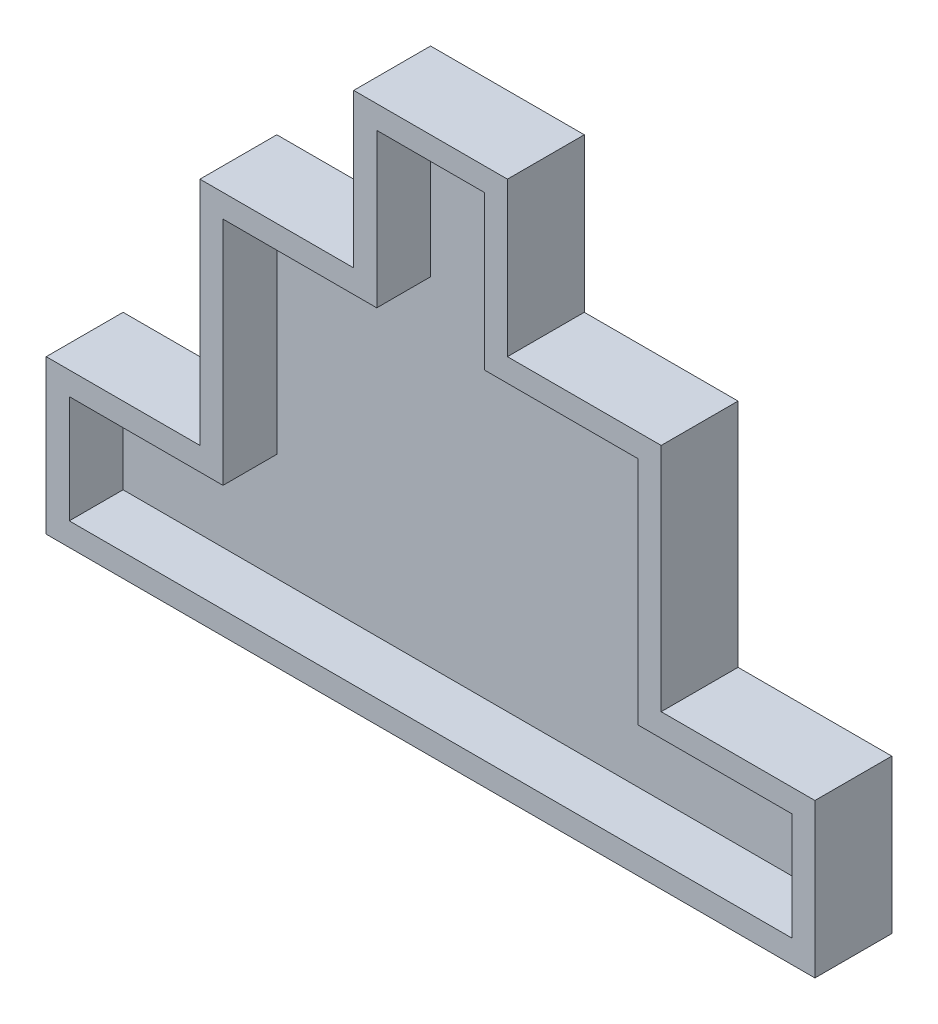
ISO-10303-21;
HEADER;
FILE_DESCRIPTION(('STEP AP214'),'2;1');
FILE_NAME('part.step','',(''),(''),'','','');
FILE_SCHEMA(('AUTOMOTIVE_DESIGN { 1 0 10303 214 1 1 1 1 }'));
ENDSEC;
DATA;
#1=APPLICATION_CONTEXT('core data for automotive mechanical design processes');
#2=APPLICATION_PROTOCOL_DEFINITION('international standard','automotive_design',2000,#1);
#3=PRODUCT_CONTEXT('',#1,'mechanical');
#4=PRODUCT('Part','Part','',(#3));
#5=PRODUCT_RELATED_PRODUCT_CATEGORY('part','',(#4));
#6=PRODUCT_DEFINITION_FORMATION('','',#4);
#7=PRODUCT_DEFINITION_CONTEXT('part definition',#1,'design');
#8=PRODUCT_DEFINITION('design','',#6,#7);
#9=PRODUCT_DEFINITION_SHAPE('','',#8);
#10=(LENGTH_UNIT() NAMED_UNIT(*) SI_UNIT(.MILLI.,.METRE.));
#11=(NAMED_UNIT(*) PLANE_ANGLE_UNIT() SI_UNIT($,.RADIAN.));
#12=(NAMED_UNIT(*) SI_UNIT($,.STERADIAN.) SOLID_ANGLE_UNIT());
#13=UNCERTAINTY_MEASURE_WITH_UNIT(LENGTH_MEASURE(1.E-05),#10,'distance_accuracy_value','');
#14=(GEOMETRIC_REPRESENTATION_CONTEXT(3) GLOBAL_UNCERTAINTY_ASSIGNED_CONTEXT((#13)) GLOBAL_UNIT_ASSIGNED_CONTEXT((#10,
#11,#12)) REPRESENTATION_CONTEXT('',''));
#15=CARTESIAN_POINT('',(0.,0.,0.));
#16=DIRECTION('',(0.,0.,1.));
#17=DIRECTION('',(1.,0.,0.));
#18=AXIS2_PLACEMENT_3D('',#15,#16,#17);
#19=CARTESIAN_POINT('',(-75.,0.,4.5));
#20=DIRECTION('',(1.,0.,0.));
#21=DIRECTION('',(0.,0.,-1.));
#22=AXIS2_PLACEMENT_3D('',#19,#20,#21);
#23=PLANE('',#22);
#24=DIRECTION('',(0.,-1.,0.));
#25=VECTOR('',#24,1.);
#26=CARTESIAN_POINT('',(-75.,0.,0.));
#27=LINE('',#26,#25);
#28=CARTESIAN_POINT('',(-75.,30.,0.));
#29=VERTEX_POINT('',#28);
#30=CARTESIAN_POINT('',(-75.,0.,0.));
#31=VERTEX_POINT('',#30);
#32=EDGE_CURVE('E379',#29,#31,#27,.T.);
#33=ORIENTED_EDGE('',*,*,#32,.T.);
#34=DIRECTION('',(0.,0.,-1.));
#35=VECTOR('',#34,1.);
#36=CARTESIAN_POINT('',(-75.,0.,4.5));
#37=LINE('',#36,#35);
#38=CARTESIAN_POINT('',(-75.,0.,15.));
#39=VERTEX_POINT('',#38);
#40=EDGE_CURVE('E11',#39,#31,#37,.T.);
#41=ORIENTED_EDGE('',*,*,#40,.F.);
#42=DIRECTION('',(0.,-1.,0.));
#43=VECTOR('',#42,1.);
#44=CARTESIAN_POINT('',(-75.,0.,15.));
#45=LINE('',#44,#43);
#46=CARTESIAN_POINT('',(-75.,30.,15.));
#47=VERTEX_POINT('',#46);
#48=EDGE_CURVE('E351',#47,#39,#45,.T.);
#49=ORIENTED_EDGE('',*,*,#48,.F.);
#50=DIRECTION('',(0.,0.,-1.));
#51=VECTOR('',#50,1.);
#52=CARTESIAN_POINT('',(-75.,30.,4.5));
#53=LINE('',#52,#51);
#54=EDGE_CURVE('E415',#47,#29,#53,.T.);
#55=ORIENTED_EDGE('',*,*,#54,.T.);
#56=EDGE_LOOP('',(#33,#41,#49,#55));
#57=FACE_BOUND('',#56,.T.);
#58=ADVANCED_FACE('F39',(#57),#23,.F.);
#59=CARTESIAN_POINT('',(75.,0.,4.5));
#60=DIRECTION('',(0.,1.,0.));
#61=DIRECTION('',(0.,0.,1.));
#62=AXIS2_PLACEMENT_3D('',#59,#60,#61);
#63=PLANE('',#62);
#64=DIRECTION('',(1.,0.,0.));
#65=VECTOR('',#64,1.);
#66=CARTESIAN_POINT('',(75.,0.,0.));
#67=LINE('',#66,#65);
#68=CARTESIAN_POINT('',(75.,0.,0.));
#69=VERTEX_POINT('',#68);
#70=EDGE_CURVE('E383',#31,#69,#67,.T.);
#71=ORIENTED_EDGE('',*,*,#70,.T.);
#72=DIRECTION('',(0.,0.,-1.));
#73=VECTOR('',#72,1.);
#74=CARTESIAN_POINT('',(75.,0.,4.5));
#75=LINE('',#74,#73);
#76=CARTESIAN_POINT('',(75.,0.,15.));
#77=VERTEX_POINT('',#76);
#78=EDGE_CURVE('E47',#77,#69,#75,.T.);
#79=ORIENTED_EDGE('',*,*,#78,.F.);
#80=DIRECTION('',(1.,0.,0.));
#81=VECTOR('',#80,1.);
#82=CARTESIAN_POINT('',(75.,0.,15.));
#83=LINE('',#82,#81);
#84=EDGE_CURVE('E355',#39,#77,#83,.T.);
#85=ORIENTED_EDGE('',*,*,#84,.F.);
#86=ORIENTED_EDGE('',*,*,#40,.T.);
#87=EDGE_LOOP('',(#71,#79,#85,#86));
#88=FACE_BOUND('',#87,.T.);
#89=ADVANCED_FACE('F500',(#88),#63,.F.);
#90=CARTESIAN_POINT('',(75.,0.,4.5));
#91=DIRECTION('',(-1.,0.,0.));
#92=DIRECTION('',(0.,0.,1.));
#93=AXIS2_PLACEMENT_3D('',#90,#91,#92);
#94=PLANE('',#93);
#95=DIRECTION('',(0.,1.,0.));
#96=VECTOR('',#95,1.);
#97=CARTESIAN_POINT('',(75.,0.,0.));
#98=LINE('',#97,#96);
#99=CARTESIAN_POINT('',(75.,30.,0.));
#100=VERTEX_POINT('',#99);
#101=EDGE_CURVE('E386',#69,#100,#98,.T.);
#102=ORIENTED_EDGE('',*,*,#101,.T.);
#103=DIRECTION('',(0.,0.,-1.));
#104=VECTOR('',#103,1.);
#105=CARTESIAN_POINT('',(75.,30.,4.5));
#106=LINE('',#105,#104);
#107=CARTESIAN_POINT('',(75.,30.,15.));
#108=VERTEX_POINT('',#107);
#109=EDGE_CURVE('E449',#108,#100,#106,.T.);
#110=ORIENTED_EDGE('',*,*,#109,.F.);
#111=DIRECTION('',(0.,1.,0.));
#112=VECTOR('',#111,1.);
#113=CARTESIAN_POINT('',(75.,30.,15.));
#114=LINE('',#113,#112);
#115=EDGE_CURVE('E359',#77,#108,#114,.T.);
#116=ORIENTED_EDGE('',*,*,#115,.F.);
#117=ORIENTED_EDGE('',*,*,#78,.T.);
#118=EDGE_LOOP('',(#102,#110,#116,#117));
#119=FACE_BOUND('',#118,.T.);
#120=ADVANCED_FACE('F457',(#119),#94,.F.);
#121=CARTESIAN_POINT('',(75.,30.,4.5));
#122=DIRECTION('',(0.,-1.,0.));
#123=DIRECTION('',(0.,0.,-1.));
#124=AXIS2_PLACEMENT_3D('',#121,#122,#123);
#125=PLANE('',#124);
#126=DIRECTION('',(-1.,0.,0.));
#127=VECTOR('',#126,1.);
#128=CARTESIAN_POINT('',(75.,30.,0.));
#129=LINE('',#128,#127);
#130=CARTESIAN_POINT('',(45.,30.,0.));
#131=VERTEX_POINT('',#130);
#132=EDGE_CURVE('E389',#100,#131,#129,.T.);
#133=ORIENTED_EDGE('',*,*,#132,.T.);
#134=DIRECTION('',(0.,0.,-1.));
#135=VECTOR('',#134,1.);
#136=CARTESIAN_POINT('',(45.,30.,4.5));
#137=LINE('',#136,#135);
#138=CARTESIAN_POINT('',(45.,30.,15.));
#139=VERTEX_POINT('',#138);
#140=EDGE_CURVE('E445',#139,#131,#137,.T.);
#141=ORIENTED_EDGE('',*,*,#140,.F.);
#142=DIRECTION('',(-1.,0.,0.));
#143=VECTOR('',#142,1.);
#144=CARTESIAN_POINT('',(45.,30.,15.));
#145=LINE('',#144,#143);
#146=EDGE_CURVE('E363',#108,#139,#145,.T.);
#147=ORIENTED_EDGE('',*,*,#146,.F.);
#148=ORIENTED_EDGE('',*,*,#109,.T.);
#149=EDGE_LOOP('',(#133,#141,#147,#148));
#150=FACE_BOUND('',#149,.T.);
#151=ADVANCED_FACE('F467',(#150),#125,.F.);
#152=CARTESIAN_POINT('',(45.,30.,4.5));
#153=DIRECTION('',(-1.,0.,0.));
#154=DIRECTION('',(0.,0.,1.));
#155=AXIS2_PLACEMENT_3D('',#152,#153,#154);
#156=PLANE('',#155);
#157=DIRECTION('',(0.,1.,0.));
#158=VECTOR('',#157,1.);
#159=CARTESIAN_POINT('',(45.,30.,0.));
#160=LINE('',#159,#158);
#161=CARTESIAN_POINT('',(45.,75.,0.));
#162=VERTEX_POINT('',#161);
#163=EDGE_CURVE('E392',#131,#162,#160,.T.);
#164=ORIENTED_EDGE('',*,*,#163,.T.);
#165=DIRECTION('',(0.,0.,-1.));
#166=VECTOR('',#165,1.);
#167=CARTESIAN_POINT('',(45.,75.,4.5));
#168=LINE('',#167,#166);
#169=CARTESIAN_POINT('',(45.,75.,15.));
#170=VERTEX_POINT('',#169);
#171=EDGE_CURVE('E441',#170,#162,#168,.T.);
#172=ORIENTED_EDGE('',*,*,#171,.F.);
#173=DIRECTION('',(0.,1.,0.));
#174=VECTOR('',#173,1.);
#175=CARTESIAN_POINT('',(45.,75.,15.));
#176=LINE('',#175,#174);
#177=EDGE_CURVE('E367',#139,#170,#176,.T.);
#178=ORIENTED_EDGE('',*,*,#177,.F.);
#179=ORIENTED_EDGE('',*,*,#140,.T.);
#180=EDGE_LOOP('',(#164,#172,#178,#179));
#181=FACE_BOUND('',#180,.T.);
#182=ADVANCED_FACE('F471',(#181),#156,.F.);
#183=CARTESIAN_POINT('',(15.,75.,4.5));
#184=DIRECTION('',(0.,-1.,0.));
#185=DIRECTION('',(0.,0.,-1.));
#186=AXIS2_PLACEMENT_3D('',#183,#184,#185);
#187=PLANE('',#186);
#188=DIRECTION('',(-1.,0.,0.));
#189=VECTOR('',#188,1.);
#190=CARTESIAN_POINT('',(15.,75.,0.));
#191=LINE('',#190,#189);
#192=CARTESIAN_POINT('',(15.,75.,0.));
#193=VERTEX_POINT('',#192);
#194=EDGE_CURVE('E395',#162,#193,#191,.T.);
#195=ORIENTED_EDGE('',*,*,#194,.T.);
#196=DIRECTION('',(0.,0.,-1.));
#197=VECTOR('',#196,1.);
#198=CARTESIAN_POINT('',(15.,75.,4.5));
#199=LINE('',#198,#197);
#200=CARTESIAN_POINT('',(15.,75.,15.));
#201=VERTEX_POINT('',#200);
#202=EDGE_CURVE('E437',#201,#193,#199,.T.);
#203=ORIENTED_EDGE('',*,*,#202,.F.);
#204=DIRECTION('',(-1.,0.,0.));
#205=VECTOR('',#204,1.);
#206=CARTESIAN_POINT('',(15.,75.,15.));
#207=LINE('',#206,#205);
#208=EDGE_CURVE('E371',#170,#201,#207,.T.);
#209=ORIENTED_EDGE('',*,*,#208,.F.);
#210=ORIENTED_EDGE('',*,*,#171,.T.);
#211=EDGE_LOOP('',(#195,#203,#209,#210));
#212=FACE_BOUND('',#211,.T.);
#213=ADVANCED_FACE('F476',(#212),#187,.F.);
#214=CARTESIAN_POINT('',(15.,75.,4.5));
#215=DIRECTION('',(-1.,0.,0.));
#216=DIRECTION('',(0.,0.,1.));
#217=AXIS2_PLACEMENT_3D('',#214,#215,#216);
#218=PLANE('',#217);
#219=DIRECTION('',(0.,1.,0.));
#220=VECTOR('',#219,1.);
#221=CARTESIAN_POINT('',(15.,75.,0.));
#222=LINE('',#221,#220);
#223=CARTESIAN_POINT('',(15.,105.,0.));
#224=VERTEX_POINT('',#223);
#225=EDGE_CURVE('E398',#193,#224,#222,.T.);
#226=ORIENTED_EDGE('',*,*,#225,.T.);
#227=DIRECTION('',(0.,0.,-1.));
#228=VECTOR('',#227,1.);
#229=CARTESIAN_POINT('',(15.,105.,4.5));
#230=LINE('',#229,#228);
#231=CARTESIAN_POINT('',(15.,105.,15.));
#232=VERTEX_POINT('',#231);
#233=EDGE_CURVE('E433',#232,#224,#230,.T.);
#234=ORIENTED_EDGE('',*,*,#233,.F.);
#235=DIRECTION('',(0.,1.,0.));
#236=VECTOR('',#235,1.);
#237=CARTESIAN_POINT('',(15.,105.,15.));
#238=LINE('',#237,#236);
#239=EDGE_CURVE('E375',#201,#232,#238,.T.);
#240=ORIENTED_EDGE('',*,*,#239,.F.);
#241=ORIENTED_EDGE('',*,*,#202,.T.);
#242=EDGE_LOOP('',(#226,#234,#240,#241));
#243=FACE_BOUND('',#242,.T.);
#244=ADVANCED_FACE('F479',(#243),#218,.F.);
#245=CARTESIAN_POINT('',(-15.,105.,4.5));
#246=DIRECTION('',(0.,-1.,0.));
#247=DIRECTION('',(0.,0.,-1.));
#248=AXIS2_PLACEMENT_3D('',#245,#246,#247);
#249=PLANE('',#248);
#250=DIRECTION('',(-1.,0.,0.));
#251=VECTOR('',#250,1.);
#252=CARTESIAN_POINT('',(-15.,105.,0.));
#253=LINE('',#252,#251);
#254=CARTESIAN_POINT('',(-15.,105.,0.));
#255=VERTEX_POINT('',#254);
#256=EDGE_CURVE('E401',#224,#255,#253,.T.);
#257=ORIENTED_EDGE('',*,*,#256,.T.);
#258=DIRECTION('',(0.,0.,-1.));
#259=VECTOR('',#258,1.);
#260=CARTESIAN_POINT('',(-15.,105.,4.5));
#261=LINE('',#260,#259);
#262=CARTESIAN_POINT('',(-15.,105.,15.));
#263=VERTEX_POINT('',#262);
#264=EDGE_CURVE('E429',#263,#255,#261,.T.);
#265=ORIENTED_EDGE('',*,*,#264,.F.);
#266=DIRECTION('',(-1.,0.,0.));
#267=VECTOR('',#266,1.);
#268=CARTESIAN_POINT('',(-15.,105.,15.));
#269=LINE('',#268,#267);
#270=EDGE_CURVE('E218',#232,#263,#269,.T.);
#271=ORIENTED_EDGE('',*,*,#270,.F.);
#272=ORIENTED_EDGE('',*,*,#233,.T.);
#273=EDGE_LOOP('',(#257,#265,#271,#272));
#274=FACE_BOUND('',#273,.T.);
#275=ADVANCED_FACE('F484',(#274),#249,.F.);
#276=CARTESIAN_POINT('',(-15.,75.,4.5));
#277=DIRECTION('',(1.,0.,0.));
#278=DIRECTION('',(0.,0.,-1.));
#279=AXIS2_PLACEMENT_3D('',#276,#277,#278);
#280=PLANE('',#279);
#281=DIRECTION('',(0.,-1.,0.));
#282=VECTOR('',#281,1.);
#283=CARTESIAN_POINT('',(-15.,75.,0.));
#284=LINE('',#283,#282);
#285=CARTESIAN_POINT('',(-15.,75.,0.));
#286=VERTEX_POINT('',#285);
#287=EDGE_CURVE('E404',#255,#286,#284,.T.);
#288=ORIENTED_EDGE('',*,*,#287,.T.);
#289=DIRECTION('',(0.,0.,-1.));
#290=VECTOR('',#289,1.);
#291=CARTESIAN_POINT('',(-15.,75.,4.5));
#292=LINE('',#291,#290);
#293=CARTESIAN_POINT('',(-15.,75.,15.));
#294=VERTEX_POINT('',#293);
#295=EDGE_CURVE('E425',#294,#286,#292,.T.);
#296=ORIENTED_EDGE('',*,*,#295,.F.);
#297=DIRECTION('',(0.,-1.,0.));
#298=VECTOR('',#297,1.);
#299=CARTESIAN_POINT('',(-15.,75.,15.));
#300=LINE('',#299,#298);
#301=EDGE_CURVE('E335',#263,#294,#300,.T.);
#302=ORIENTED_EDGE('',*,*,#301,.F.);
#303=ORIENTED_EDGE('',*,*,#264,.T.);
#304=EDGE_LOOP('',(#288,#296,#302,#303));
#305=FACE_BOUND('',#304,.T.);
#306=ADVANCED_FACE('F488',(#305),#280,.F.);
#307=CARTESIAN_POINT('',(-45.,75.,4.5));
#308=DIRECTION('',(0.,-1.,0.));
#309=DIRECTION('',(0.,0.,-1.));
#310=AXIS2_PLACEMENT_3D('',#307,#308,#309);
#311=PLANE('',#310);
#312=DIRECTION('',(-1.,0.,0.));
#313=VECTOR('',#312,1.);
#314=CARTESIAN_POINT('',(-45.,75.,0.));
#315=LINE('',#314,#313);
#316=CARTESIAN_POINT('',(-45.,75.,0.));
#317=VERTEX_POINT('',#316);
#318=EDGE_CURVE('E407',#286,#317,#315,.T.);
#319=ORIENTED_EDGE('',*,*,#318,.T.);
#320=DIRECTION('',(0.,0.,-1.));
#321=VECTOR('',#320,1.);
#322=CARTESIAN_POINT('',(-45.,75.,4.5));
#323=LINE('',#322,#321);
#324=CARTESIAN_POINT('',(-45.,75.,15.));
#325=VERTEX_POINT('',#324);
#326=EDGE_CURVE('E421',#325,#317,#323,.T.);
#327=ORIENTED_EDGE('',*,*,#326,.F.);
#328=DIRECTION('',(-1.,0.,0.));
#329=VECTOR('',#328,1.);
#330=CARTESIAN_POINT('',(-45.,75.,15.));
#331=LINE('',#330,#329);
#332=EDGE_CURVE('E339',#294,#325,#331,.T.);
#333=ORIENTED_EDGE('',*,*,#332,.F.);
#334=ORIENTED_EDGE('',*,*,#295,.T.);
#335=EDGE_LOOP('',(#319,#327,#333,#334));
#336=FACE_BOUND('',#335,.T.);
#337=ADVANCED_FACE('F492',(#336),#311,.F.);
#338=CARTESIAN_POINT('',(-45.,30.,4.5));
#339=DIRECTION('',(1.,0.,0.));
#340=DIRECTION('',(0.,0.,-1.));
#341=AXIS2_PLACEMENT_3D('',#338,#339,#340);
#342=PLANE('',#341);
#343=DIRECTION('',(0.,-1.,0.));
#344=VECTOR('',#343,1.);
#345=CARTESIAN_POINT('',(-45.,30.,0.));
#346=LINE('',#345,#344);
#347=CARTESIAN_POINT('',(-45.,30.,0.));
#348=VERTEX_POINT('',#347);
#349=EDGE_CURVE('E410',#317,#348,#346,.T.);
#350=ORIENTED_EDGE('',*,*,#349,.T.);
#351=DIRECTION('',(0.,0.,-1.));
#352=VECTOR('',#351,1.);
#353=CARTESIAN_POINT('',(-45.,30.,4.5));
#354=LINE('',#353,#352);
#355=CARTESIAN_POINT('',(-45.,30.,15.));
#356=VERTEX_POINT('',#355);
#357=EDGE_CURVE('E418',#356,#348,#354,.T.);
#358=ORIENTED_EDGE('',*,*,#357,.F.);
#359=DIRECTION('',(0.,-1.,0.));
#360=VECTOR('',#359,1.);
#361=CARTESIAN_POINT('',(-45.,30.,15.));
#362=LINE('',#361,#360);
#363=EDGE_CURVE('E343',#325,#356,#362,.T.);
#364=ORIENTED_EDGE('',*,*,#363,.F.);
#365=ORIENTED_EDGE('',*,*,#326,.T.);
#366=EDGE_LOOP('',(#350,#358,#364,#365));
#367=FACE_BOUND('',#366,.T.);
#368=ADVANCED_FACE('F495',(#367),#342,.F.);
#369=CARTESIAN_POINT('',(-75.,30.,4.5));
#370=DIRECTION('',(0.,-1.,0.));
#371=DIRECTION('',(0.,0.,-1.));
#372=AXIS2_PLACEMENT_3D('',#369,#370,#371);
#373=PLANE('',#372);
#374=DIRECTION('',(-1.,0.,0.));
#375=VECTOR('',#374,1.);
#376=CARTESIAN_POINT('',(-75.,30.,0.));
#377=LINE('',#376,#375);
#378=EDGE_CURVE('E62',#348,#29,#377,.T.);
#379=ORIENTED_EDGE('',*,*,#378,.T.);
#380=ORIENTED_EDGE('',*,*,#54,.F.);
#381=DIRECTION('',(-1.,0.,0.));
#382=VECTOR('',#381,1.);
#383=CARTESIAN_POINT('',(-75.,30.,15.));
#384=LINE('',#383,#382);
#385=EDGE_CURVE('E347',#356,#47,#384,.T.);
#386=ORIENTED_EDGE('',*,*,#385,.F.);
#387=ORIENTED_EDGE('',*,*,#357,.T.);
#388=EDGE_LOOP('',(#379,#380,#386,#387));
#389=FACE_BOUND('',#388,.T.);
#390=ADVANCED_FACE('F499',(#389),#373,.F.);
#391=CARTESIAN_POINT('',(0.,0.,0.));
#392=DIRECTION('',(0.,0.,-1.));
#393=DIRECTION('',(-1.,0.,0.));
#394=AXIS2_PLACEMENT_3D('',#391,#392,#393);
#395=PLANE('',#394);
#396=ORIENTED_EDGE('',*,*,#32,.F.);
#397=ORIENTED_EDGE('',*,*,#378,.F.);
#398=ORIENTED_EDGE('',*,*,#349,.F.);
#399=ORIENTED_EDGE('',*,*,#318,.F.);
#400=ORIENTED_EDGE('',*,*,#287,.F.);
#401=ORIENTED_EDGE('',*,*,#256,.F.);
#402=ORIENTED_EDGE('',*,*,#225,.F.);
#403=ORIENTED_EDGE('',*,*,#194,.F.);
#404=ORIENTED_EDGE('',*,*,#163,.F.);
#405=ORIENTED_EDGE('',*,*,#132,.F.);
#406=ORIENTED_EDGE('',*,*,#101,.F.);
#407=ORIENTED_EDGE('',*,*,#70,.F.);
#408=EDGE_LOOP('',(#396,#397,#398,#399,#400,#401,#402,#403,#404,#405,#406,#407));
#409=FACE_BOUND('',#408,.T.);
#410=ADVANCED_FACE('F463',(#409),#395,.T.);
#411=CARTESIAN_POINT('',(0.,0.,15.));
#412=DIRECTION('',(0.,0.,-1.));
#413=DIRECTION('',(-1.,0.,0.));
#414=AXIS2_PLACEMENT_3D('',#411,#412,#413);
#415=PLANE('',#414);
#416=ORIENTED_EDGE('',*,*,#270,.T.);
#417=ORIENTED_EDGE('',*,*,#301,.T.);
#418=ORIENTED_EDGE('',*,*,#332,.T.);
#419=ORIENTED_EDGE('',*,*,#363,.T.);
#420=ORIENTED_EDGE('',*,*,#385,.T.);
#421=ORIENTED_EDGE('',*,*,#48,.T.);
#422=ORIENTED_EDGE('',*,*,#84,.T.);
#423=ORIENTED_EDGE('',*,*,#115,.T.);
#424=ORIENTED_EDGE('',*,*,#146,.T.);
#425=ORIENTED_EDGE('',*,*,#177,.T.);
#426=ORIENTED_EDGE('',*,*,#208,.T.);
#427=ORIENTED_EDGE('',*,*,#239,.T.);
#428=EDGE_LOOP('',(#416,#417,#418,#419,#420,#421,#422,#423,#424,#425,#426,#427));
#429=FACE_BOUND('',#428,.T.);
#430=DIRECTION('',(0.,1.,0.));
#431=VECTOR('',#430,1.);
#432=CARTESIAN_POINT('',(70.5,25.5,15.));
#433=LINE('',#432,#431);
#434=CARTESIAN_POINT('',(70.5,4.50000000000001,15.));
#435=VERTEX_POINT('',#434);
#436=CARTESIAN_POINT('',(70.5,25.5,15.));
#437=VERTEX_POINT('',#436);
#438=EDGE_CURVE('E212',#435,#437,#433,.T.);
#439=ORIENTED_EDGE('',*,*,#438,.F.);
#440=DIRECTION('',(1.,0.,0.));
#441=VECTOR('',#440,1.);
#442=CARTESIAN_POINT('',(70.5,4.50000000000001,15.));
#443=LINE('',#442,#441);
#444=CARTESIAN_POINT('',(-70.5,4.49999999999999,15.));
#445=VERTEX_POINT('',#444);
#446=EDGE_CURVE('E201',#445,#435,#443,.T.);
#447=ORIENTED_EDGE('',*,*,#446,.F.);
#448=DIRECTION('',(0.,-1.,0.));
#449=VECTOR('',#448,1.);
#450=CARTESIAN_POINT('',(-70.5,4.49999999999999,15.));
#451=LINE('',#450,#449);
#452=CARTESIAN_POINT('',(-70.5,25.5,15.));
#453=VERTEX_POINT('',#452);
#454=EDGE_CURVE('E254',#453,#445,#451,.T.);
#455=ORIENTED_EDGE('',*,*,#454,.F.);
#456=DIRECTION('',(-1.,0.,0.));
#457=VECTOR('',#456,1.);
#458=CARTESIAN_POINT('',(-70.5,25.5,15.));
#459=LINE('',#458,#457);
#460=CARTESIAN_POINT('',(-40.5,25.5,15.));
#461=VERTEX_POINT('',#460);
#462=EDGE_CURVE('E251',#461,#453,#459,.T.);
#463=ORIENTED_EDGE('',*,*,#462,.F.);
#464=DIRECTION('',(0.,-1.,0.));
#465=VECTOR('',#464,1.);
#466=CARTESIAN_POINT('',(-40.5,25.5,15.));
#467=LINE('',#466,#465);
#468=CARTESIAN_POINT('',(-40.5,70.5,15.));
#469=VERTEX_POINT('',#468);
#470=EDGE_CURVE('E248',#469,#461,#467,.T.);
#471=ORIENTED_EDGE('',*,*,#470,.F.);
#472=DIRECTION('',(-1.,0.,0.));
#473=VECTOR('',#472,1.);
#474=CARTESIAN_POINT('',(-40.5,70.5,15.));
#475=LINE('',#474,#473);
#476=CARTESIAN_POINT('',(-10.5,70.5,15.));
#477=VERTEX_POINT('',#476);
#478=EDGE_CURVE('E245',#477,#469,#475,.T.);
#479=ORIENTED_EDGE('',*,*,#478,.F.);
#480=DIRECTION('',(0.,-1.,0.));
#481=VECTOR('',#480,1.);
#482=CARTESIAN_POINT('',(-10.5,70.5,15.));
#483=LINE('',#482,#481);
#484=CARTESIAN_POINT('',(-10.5,100.5,15.));
#485=VERTEX_POINT('',#484);
#486=EDGE_CURVE('E242',#485,#477,#483,.T.);
#487=ORIENTED_EDGE('',*,*,#486,.F.);
#488=DIRECTION('',(-1.,0.,0.));
#489=VECTOR('',#488,1.);
#490=CARTESIAN_POINT('',(-10.5,100.5,15.));
#491=LINE('',#490,#489);
#492=CARTESIAN_POINT('',(10.5,100.5,15.));
#493=VERTEX_POINT('',#492);
#494=EDGE_CURVE('E239',#493,#485,#491,.T.);
#495=ORIENTED_EDGE('',*,*,#494,.F.);
#496=DIRECTION('',(0.,1.,0.));
#497=VECTOR('',#496,1.);
#498=CARTESIAN_POINT('',(10.5,100.5,15.));
#499=LINE('',#498,#497);
#500=CARTESIAN_POINT('',(10.5,70.5,15.));
#501=VERTEX_POINT('',#500);
#502=EDGE_CURVE('E236',#501,#493,#499,.T.);
#503=ORIENTED_EDGE('',*,*,#502,.F.);
#504=DIRECTION('',(-1.,0.,0.));
#505=VECTOR('',#504,1.);
#506=CARTESIAN_POINT('',(10.5,70.5,15.));
#507=LINE('',#506,#505);
#508=CARTESIAN_POINT('',(40.5,70.5,15.));
#509=VERTEX_POINT('',#508);
#510=EDGE_CURVE('E233',#509,#501,#507,.T.);
#511=ORIENTED_EDGE('',*,*,#510,.F.);
#512=DIRECTION('',(0.,1.,0.));
#513=VECTOR('',#512,1.);
#514=CARTESIAN_POINT('',(40.5,70.5,15.));
#515=LINE('',#514,#513);
#516=CARTESIAN_POINT('',(40.5,25.5,15.));
#517=VERTEX_POINT('',#516);
#518=EDGE_CURVE('E228',#517,#509,#515,.T.);
#519=ORIENTED_EDGE('',*,*,#518,.F.);
#520=DIRECTION('',(-1.,0.,0.));
#521=VECTOR('',#520,1.);
#522=CARTESIAN_POINT('',(40.5,25.5,15.));
#523=LINE('',#522,#521);
#524=EDGE_CURVE('E224',#437,#517,#523,.T.);
#525=ORIENTED_EDGE('',*,*,#524,.F.);
#526=EDGE_LOOP('',(#439,#447,#455,#463,#471,#479,#487,#495,#503,#511,#519,#525));
#527=FACE_BOUND('',#526,.T.);
#528=ADVANCED_FACE('F222',(#429,#527),#415,.F.);
#529=CARTESIAN_POINT('',(70.5,25.5,15.));
#530=DIRECTION('',(-1.,0.,0.));
#531=DIRECTION('',(0.,0.,1.));
#532=AXIS2_PLACEMENT_3D('',#529,#530,#531);
#533=PLANE('',#532);
#534=DIRECTION('',(0.,1.,0.));
#535=VECTOR('',#534,1.);
#536=CARTESIAN_POINT('',(70.5,25.5,4.5));
#537=LINE('',#536,#535);
#538=CARTESIAN_POINT('',(70.5,4.50000000000001,4.5));
#539=VERTEX_POINT('',#538);
#540=CARTESIAN_POINT('',(70.5,25.5,4.5));
#541=VERTEX_POINT('',#540);
#542=EDGE_CURVE('E54',#539,#541,#537,.T.);
#543=ORIENTED_EDGE('',*,*,#542,.F.);
#544=DIRECTION('',(0.,0.,-1.));
#545=VECTOR('',#544,1.);
#546=CARTESIAN_POINT('',(70.5,4.50000000000001,15.));
#547=LINE('',#546,#545);
#548=EDGE_CURVE('E204',#435,#539,#547,.T.);
#549=ORIENTED_EDGE('',*,*,#548,.F.);
#550=ORIENTED_EDGE('',*,*,#438,.T.);
#551=DIRECTION('',(0.,0.,-1.));
#552=VECTOR('',#551,1.);
#553=CARTESIAN_POINT('',(70.5,25.5,15.));
#554=LINE('',#553,#552);
#555=EDGE_CURVE('E219',#437,#541,#554,.T.);
#556=ORIENTED_EDGE('',*,*,#555,.T.);
#557=EDGE_LOOP('',(#543,#549,#550,#556));
#558=FACE_BOUND('',#557,.T.);
#559=ADVANCED_FACE('F215',(#558),#533,.T.);
#560=CARTESIAN_POINT('',(40.5,25.5,15.));
#561=DIRECTION('',(0.,-1.,0.));
#562=DIRECTION('',(0.,0.,-1.));
#563=AXIS2_PLACEMENT_3D('',#560,#561,#562);
#564=PLANE('',#563);
#565=DIRECTION('',(-1.,0.,0.));
#566=VECTOR('',#565,1.);
#567=CARTESIAN_POINT('',(40.5,25.5,4.5));
#568=LINE('',#567,#566);
#569=CARTESIAN_POINT('',(40.5,25.5,4.5));
#570=VERTEX_POINT('',#569);
#571=EDGE_CURVE('E259',#541,#570,#568,.T.);
#572=ORIENTED_EDGE('',*,*,#571,.F.);
#573=ORIENTED_EDGE('',*,*,#555,.F.);
#574=ORIENTED_EDGE('',*,*,#524,.T.);
#575=DIRECTION('',(0.,0.,-1.));
#576=VECTOR('',#575,1.);
#577=CARTESIAN_POINT('',(40.5,25.5,15.));
#578=LINE('',#577,#576);
#579=EDGE_CURVE('E327',#517,#570,#578,.T.);
#580=ORIENTED_EDGE('',*,*,#579,.T.);
#581=EDGE_LOOP('',(#572,#573,#574,#580));
#582=FACE_BOUND('',#581,.T.);
#583=ADVANCED_FACE('F536',(#582),#564,.T.);
#584=CARTESIAN_POINT('',(40.5,70.5,15.));
#585=DIRECTION('',(-1.,0.,0.));
#586=DIRECTION('',(0.,-1.,0.));
#587=AXIS2_PLACEMENT_3D('',#584,#585,#586);
#588=PLANE('',#587);
#589=DIRECTION('',(0.,1.,0.));
#590=VECTOR('',#589,1.);
#591=CARTESIAN_POINT('',(40.5,70.5,4.5));
#592=LINE('',#591,#590);
#593=CARTESIAN_POINT('',(40.5,70.5,4.5));
#594=VERTEX_POINT('',#593);
#595=EDGE_CURVE('E263',#570,#594,#592,.T.);
#596=ORIENTED_EDGE('',*,*,#595,.F.);
#597=ORIENTED_EDGE('',*,*,#579,.F.);
#598=ORIENTED_EDGE('',*,*,#518,.T.);
#599=DIRECTION('',(0.,0.,-1.));
#600=VECTOR('',#599,1.);
#601=CARTESIAN_POINT('',(40.5,70.5,15.));
#602=LINE('',#601,#600);
#603=EDGE_CURVE('E324',#509,#594,#602,.T.);
#604=ORIENTED_EDGE('',*,*,#603,.T.);
#605=EDGE_LOOP('',(#596,#597,#598,#604));
#606=FACE_BOUND('',#605,.T.);
#607=ADVANCED_FACE('F539',(#606),#588,.T.);
#608=CARTESIAN_POINT('',(10.5,70.5,15.));
#609=DIRECTION('',(0.,-1.,0.));
#610=DIRECTION('',(0.,0.,-1.));
#611=AXIS2_PLACEMENT_3D('',#608,#609,#610);
#612=PLANE('',#611);
#613=DIRECTION('',(-1.,0.,0.));
#614=VECTOR('',#613,1.);
#615=CARTESIAN_POINT('',(10.5,70.5,4.5));
#616=LINE('',#615,#614);
#617=CARTESIAN_POINT('',(10.5,70.5,4.5));
#618=VERTEX_POINT('',#617);
#619=EDGE_CURVE('E267',#594,#618,#616,.T.);
#620=ORIENTED_EDGE('',*,*,#619,.F.);
#621=ORIENTED_EDGE('',*,*,#603,.F.);
#622=ORIENTED_EDGE('',*,*,#510,.T.);
#623=DIRECTION('',(0.,0.,-1.));
#624=VECTOR('',#623,1.);
#625=CARTESIAN_POINT('',(10.5,70.5,15.));
#626=LINE('',#625,#624);
#627=EDGE_CURVE('E321',#501,#618,#626,.T.);
#628=ORIENTED_EDGE('',*,*,#627,.T.);
#629=EDGE_LOOP('',(#620,#621,#622,#628));
#630=FACE_BOUND('',#629,.T.);
#631=ADVANCED_FACE('F543',(#630),#612,.T.);
#632=CARTESIAN_POINT('',(10.5,100.5,15.));
#633=DIRECTION('',(-1.,0.,0.));
#634=DIRECTION('',(0.,-1.,0.));
#635=AXIS2_PLACEMENT_3D('',#632,#633,#634);
#636=PLANE('',#635);
#637=DIRECTION('',(0.,1.,0.));
#638=VECTOR('',#637,1.);
#639=CARTESIAN_POINT('',(10.5,100.5,4.5));
#640=LINE('',#639,#638);
#641=CARTESIAN_POINT('',(10.5,100.5,4.5));
#642=VERTEX_POINT('',#641);
#643=EDGE_CURVE('E271',#618,#642,#640,.T.);
#644=ORIENTED_EDGE('',*,*,#643,.F.);
#645=ORIENTED_EDGE('',*,*,#627,.F.);
#646=ORIENTED_EDGE('',*,*,#502,.T.);
#647=DIRECTION('',(0.,0.,-1.));
#648=VECTOR('',#647,1.);
#649=CARTESIAN_POINT('',(10.5,100.5,15.));
#650=LINE('',#649,#648);
#651=EDGE_CURVE('E318',#493,#642,#650,.T.);
#652=ORIENTED_EDGE('',*,*,#651,.T.);
#653=EDGE_LOOP('',(#644,#645,#646,#652));
#654=FACE_BOUND('',#653,.T.);
#655=ADVANCED_FACE('F547',(#654),#636,.T.);
#656=CARTESIAN_POINT('',(-10.5,100.5,15.));
#657=DIRECTION('',(0.,-1.,0.));
#658=DIRECTION('',(0.,0.,-1.));
#659=AXIS2_PLACEMENT_3D('',#656,#657,#658);
#660=PLANE('',#659);
#661=DIRECTION('',(-1.,0.,0.));
#662=VECTOR('',#661,1.);
#663=CARTESIAN_POINT('',(-10.5,100.5,4.5));
#664=LINE('',#663,#662);
#665=CARTESIAN_POINT('',(-10.5,100.5,4.5));
#666=VERTEX_POINT('',#665);
#667=EDGE_CURVE('E275',#642,#666,#664,.T.);
#668=ORIENTED_EDGE('',*,*,#667,.F.);
#669=ORIENTED_EDGE('',*,*,#651,.F.);
#670=ORIENTED_EDGE('',*,*,#494,.T.);
#671=DIRECTION('',(0.,0.,-1.));
#672=VECTOR('',#671,1.);
#673=CARTESIAN_POINT('',(-10.5,100.5,15.));
#674=LINE('',#673,#672);
#675=EDGE_CURVE('E315',#485,#666,#674,.T.);
#676=ORIENTED_EDGE('',*,*,#675,.T.);
#677=EDGE_LOOP('',(#668,#669,#670,#676));
#678=FACE_BOUND('',#677,.T.);
#679=ADVANCED_FACE('F551',(#678),#660,.T.);
#680=CARTESIAN_POINT('',(-10.5,70.5,15.));
#681=DIRECTION('',(1.,0.,0.));
#682=DIRECTION('',(0.,0.,-1.));
#683=AXIS2_PLACEMENT_3D('',#680,#681,#682);
#684=PLANE('',#683);
#685=DIRECTION('',(0.,-1.,0.));
#686=VECTOR('',#685,1.);
#687=CARTESIAN_POINT('',(-10.5,70.5,4.5));
#688=LINE('',#687,#686);
#689=CARTESIAN_POINT('',(-10.5,70.5,4.5));
#690=VERTEX_POINT('',#689);
#691=EDGE_CURVE('E279',#666,#690,#688,.T.);
#692=ORIENTED_EDGE('',*,*,#691,.F.);
#693=ORIENTED_EDGE('',*,*,#675,.F.);
#694=ORIENTED_EDGE('',*,*,#486,.T.);
#695=DIRECTION('',(0.,0.,-1.));
#696=VECTOR('',#695,1.);
#697=CARTESIAN_POINT('',(-10.5,70.5,15.));
#698=LINE('',#697,#696);
#699=EDGE_CURVE('E312',#477,#690,#698,.T.);
#700=ORIENTED_EDGE('',*,*,#699,.T.);
#701=EDGE_LOOP('',(#692,#693,#694,#700));
#702=FACE_BOUND('',#701,.T.);
#703=ADVANCED_FACE('F555',(#702),#684,.T.);
#704=CARTESIAN_POINT('',(-40.5,70.5,15.));
#705=DIRECTION('',(0.,-1.,0.));
#706=DIRECTION('',(0.,0.,-1.));
#707=AXIS2_PLACEMENT_3D('',#704,#705,#706);
#708=PLANE('',#707);
#709=DIRECTION('',(-1.,0.,0.));
#710=VECTOR('',#709,1.);
#711=CARTESIAN_POINT('',(-40.5,70.5,4.5));
#712=LINE('',#711,#710);
#713=CARTESIAN_POINT('',(-40.5,70.5,4.5));
#714=VERTEX_POINT('',#713);
#715=EDGE_CURVE('E283',#690,#714,#712,.T.);
#716=ORIENTED_EDGE('',*,*,#715,.F.);
#717=ORIENTED_EDGE('',*,*,#699,.F.);
#718=ORIENTED_EDGE('',*,*,#478,.T.);
#719=DIRECTION('',(0.,0.,-1.));
#720=VECTOR('',#719,1.);
#721=CARTESIAN_POINT('',(-40.5,70.5,15.));
#722=LINE('',#721,#720);
#723=EDGE_CURVE('E309',#469,#714,#722,.T.);
#724=ORIENTED_EDGE('',*,*,#723,.T.);
#725=EDGE_LOOP('',(#716,#717,#718,#724));
#726=FACE_BOUND('',#725,.T.);
#727=ADVANCED_FACE('F559',(#726),#708,.T.);
#728=CARTESIAN_POINT('',(-40.5,25.5,15.));
#729=DIRECTION('',(1.,0.,0.));
#730=DIRECTION('',(0.,0.,-1.));
#731=AXIS2_PLACEMENT_3D('',#728,#729,#730);
#732=PLANE('',#731);
#733=DIRECTION('',(0.,-1.,0.));
#734=VECTOR('',#733,1.);
#735=CARTESIAN_POINT('',(-40.5,25.5,4.5));
#736=LINE('',#735,#734);
#737=CARTESIAN_POINT('',(-40.5,25.5,4.5));
#738=VERTEX_POINT('',#737);
#739=EDGE_CURVE('E287',#714,#738,#736,.T.);
#740=ORIENTED_EDGE('',*,*,#739,.F.);
#741=ORIENTED_EDGE('',*,*,#723,.F.);
#742=ORIENTED_EDGE('',*,*,#470,.T.);
#743=DIRECTION('',(0.,0.,-1.));
#744=VECTOR('',#743,1.);
#745=CARTESIAN_POINT('',(-40.5,25.5,15.));
#746=LINE('',#745,#744);
#747=EDGE_CURVE('E306',#461,#738,#746,.T.);
#748=ORIENTED_EDGE('',*,*,#747,.T.);
#749=EDGE_LOOP('',(#740,#741,#742,#748));
#750=FACE_BOUND('',#749,.T.);
#751=ADVANCED_FACE('F563',(#750),#732,.T.);
#752=CARTESIAN_POINT('',(-70.5,25.5,15.));
#753=DIRECTION('',(0.,-1.,0.));
#754=DIRECTION('',(0.,0.,-1.));
#755=AXIS2_PLACEMENT_3D('',#752,#753,#754);
#756=PLANE('',#755);
#757=DIRECTION('',(-1.,0.,0.));
#758=VECTOR('',#757,1.);
#759=CARTESIAN_POINT('',(-70.5,25.5,4.5));
#760=LINE('',#759,#758);
#761=CARTESIAN_POINT('',(-70.5,25.5,4.5));
#762=VERTEX_POINT('',#761);
#763=EDGE_CURVE('E291',#738,#762,#760,.T.);
#764=ORIENTED_EDGE('',*,*,#763,.F.);
#765=ORIENTED_EDGE('',*,*,#747,.F.);
#766=ORIENTED_EDGE('',*,*,#462,.T.);
#767=DIRECTION('',(0.,0.,-1.));
#768=VECTOR('',#767,1.);
#769=CARTESIAN_POINT('',(-70.5,25.5,15.));
#770=LINE('',#769,#768);
#771=EDGE_CURVE('E303',#453,#762,#770,.T.);
#772=ORIENTED_EDGE('',*,*,#771,.T.);
#773=EDGE_LOOP('',(#764,#765,#766,#772));
#774=FACE_BOUND('',#773,.T.);
#775=ADVANCED_FACE('F567',(#774),#756,.T.);
#776=CARTESIAN_POINT('',(-70.5,4.49999999999999,15.));
#777=DIRECTION('',(1.,0.,0.));
#778=DIRECTION('',(0.,0.,-1.));
#779=AXIS2_PLACEMENT_3D('',#776,#777,#778);
#780=PLANE('',#779);
#781=DIRECTION('',(0.,-1.,0.));
#782=VECTOR('',#781,1.);
#783=CARTESIAN_POINT('',(-70.5,4.49999999999999,4.5));
#784=LINE('',#783,#782);
#785=CARTESIAN_POINT('',(-70.5,4.49999999999999,4.5));
#786=VERTEX_POINT('',#785);
#787=EDGE_CURVE('E295',#762,#786,#784,.T.);
#788=ORIENTED_EDGE('',*,*,#787,.F.);
#789=ORIENTED_EDGE('',*,*,#771,.F.);
#790=ORIENTED_EDGE('',*,*,#454,.T.);
#791=DIRECTION('',(0.,0.,-1.));
#792=VECTOR('',#791,1.);
#793=CARTESIAN_POINT('',(-70.5,4.49999999999999,15.));
#794=LINE('',#793,#792);
#795=EDGE_CURVE('E206',#445,#786,#794,.T.);
#796=ORIENTED_EDGE('',*,*,#795,.T.);
#797=EDGE_LOOP('',(#788,#789,#790,#796));
#798=FACE_BOUND('',#797,.T.);
#799=ADVANCED_FACE('F571',(#798),#780,.T.);
#800=CARTESIAN_POINT('',(1.16883996728757,4.5,15.));
#801=DIRECTION('',(0.,1.,0.));
#802=DIRECTION('',(-1.,0.,0.));
#803=AXIS2_PLACEMENT_3D('',#800,#801,#802);
#804=PLANE('',#803);
#805=DIRECTION('',(1.,0.,0.));
#806=VECTOR('',#805,1.);
#807=CARTESIAN_POINT('',(1.16883996728757,4.5,4.5));
#808=LINE('',#807,#806);
#809=EDGE_CURVE('E213',#786,#539,#808,.T.);
#810=ORIENTED_EDGE('',*,*,#809,.F.);
#811=ORIENTED_EDGE('',*,*,#795,.F.);
#812=ORIENTED_EDGE('',*,*,#446,.T.);
#813=ORIENTED_EDGE('',*,*,#548,.T.);
#814=EDGE_LOOP('',(#810,#811,#812,#813));
#815=FACE_BOUND('',#814,.T.);
#816=ADVANCED_FACE('F203',(#815),#804,.T.);
#817=CARTESIAN_POINT('',(0.,0.,4.5));
#818=DIRECTION('',(0.,0.,-1.));
#819=DIRECTION('',(-1.,0.,0.));
#820=AXIS2_PLACEMENT_3D('',#817,#818,#819);
#821=PLANE('',#820);
#822=ORIENTED_EDGE('',*,*,#809,.T.);
#823=ORIENTED_EDGE('',*,*,#542,.T.);
#824=ORIENTED_EDGE('',*,*,#571,.T.);
#825=ORIENTED_EDGE('',*,*,#595,.T.);
#826=ORIENTED_EDGE('',*,*,#619,.T.);
#827=ORIENTED_EDGE('',*,*,#643,.T.);
#828=ORIENTED_EDGE('',*,*,#667,.T.);
#829=ORIENTED_EDGE('',*,*,#691,.T.);
#830=ORIENTED_EDGE('',*,*,#715,.T.);
#831=ORIENTED_EDGE('',*,*,#739,.T.);
#832=ORIENTED_EDGE('',*,*,#763,.T.);
#833=ORIENTED_EDGE('',*,*,#787,.T.);
#834=EDGE_LOOP('',(#822,#823,#824,#825,#826,#827,#828,#829,#830,#831,#832,#833));
#835=FACE_BOUND('',#834,.T.);
#836=ADVANCED_FACE('F528',(#835),#821,.F.);
#837=CLOSED_SHELL('',(#58,#89,#120,#151,#182,#213,#244,#275,#306,#337,#368,#390,#410,#528,#559,
#583,#607,#631,#655,#679,#703,#727,#751,#775,#799,#816,#836));
#838=MANIFOLD_SOLID_BREP('B2',#837);
#839=ADVANCED_BREP_SHAPE_REPRESENTATION('',(#18,#838),#14);
#840=SHAPE_DEFINITION_REPRESENTATION(#9,#839);
ENDSEC;
END-ISO-10303-21;
